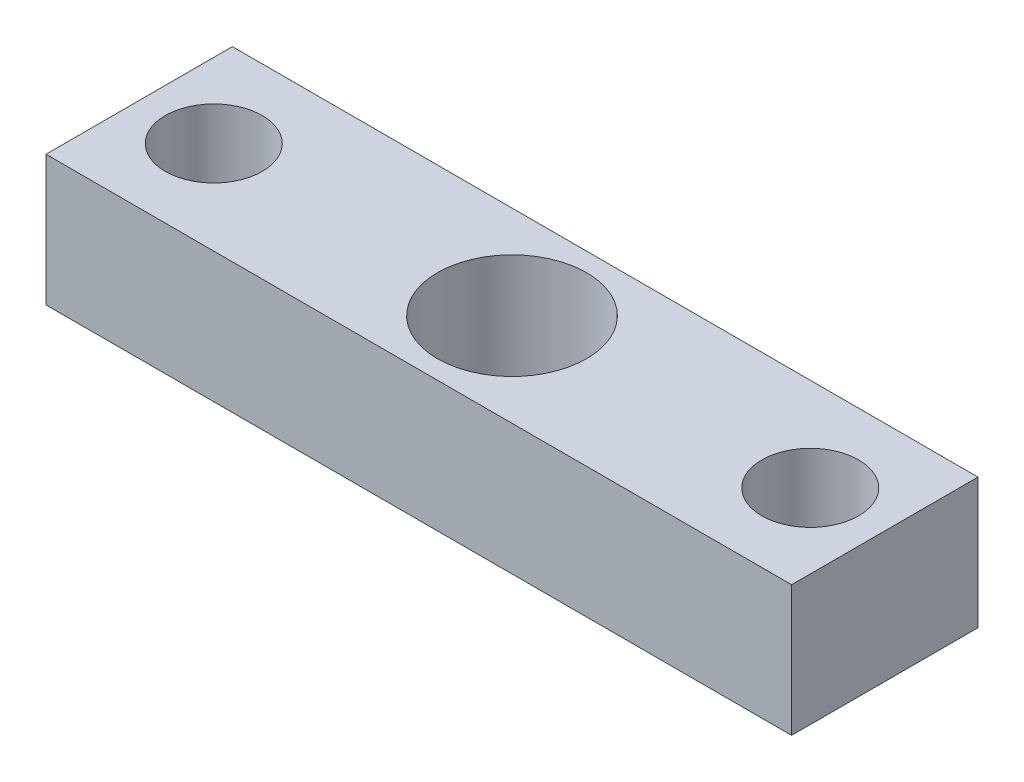
ISO-10303-21;
HEADER;
FILE_DESCRIPTION(('STEP AP214'),'2;1');
FILE_NAME('part.step','',(''),(''),'','','');
FILE_SCHEMA(('AUTOMOTIVE_DESIGN { 1 0 10303 214 1 1 1 1 }'));
ENDSEC;
DATA;
#1=APPLICATION_CONTEXT('core data for automotive mechanical design processes');
#2=APPLICATION_PROTOCOL_DEFINITION('international standard','automotive_design',2000,#1);
#3=PRODUCT_CONTEXT('',#1,'mechanical');
#4=PRODUCT('Part','Part','',(#3));
#5=PRODUCT_RELATED_PRODUCT_CATEGORY('part','',(#4));
#6=PRODUCT_DEFINITION_FORMATION('','',#4);
#7=PRODUCT_DEFINITION_CONTEXT('part definition',#1,'design');
#8=PRODUCT_DEFINITION('design','',#6,#7);
#9=PRODUCT_DEFINITION_SHAPE('','',#8);
#10=(LENGTH_UNIT() NAMED_UNIT(*) SI_UNIT(.MILLI.,.METRE.));
#11=(NAMED_UNIT(*) PLANE_ANGLE_UNIT() SI_UNIT($,.RADIAN.));
#12=(NAMED_UNIT(*) SI_UNIT($,.STERADIAN.) SOLID_ANGLE_UNIT());
#13=UNCERTAINTY_MEASURE_WITH_UNIT(LENGTH_MEASURE(1.E-05),#10,'distance_accuracy_value','');
#14=(GEOMETRIC_REPRESENTATION_CONTEXT(3) GLOBAL_UNCERTAINTY_ASSIGNED_CONTEXT((#13)) GLOBAL_UNIT_ASSIGNED_CONTEXT((#10,
#11,#12)) REPRESENTATION_CONTEXT('',''));
#15=CARTESIAN_POINT('',(0.,0.,0.));
#16=DIRECTION('',(0.,0.,1.));
#17=DIRECTION('',(1.,0.,0.));
#18=AXIS2_PLACEMENT_3D('',#15,#16,#17);
#19=CARTESIAN_POINT('',(0.,7.,0.));
#20=DIRECTION('',(0.,1.,0.));
#21=DIRECTION('',(0.,0.,1.));
#22=AXIS2_PLACEMENT_3D('',#19,#20,#21);
#23=PLANE('',#22);
#24=CARTESIAN_POINT('',(16.,7.,0.));
#25=DIRECTION('',(0.,1.,0.));
#26=DIRECTION('',(0.,0.,1.));
#27=AXIS2_PLACEMENT_3D('',#24,#25,#26);
#28=CIRCLE('',#27,2.6);
#29=CARTESIAN_POINT('',(16.,7.,2.6));
#30=VERTEX_POINT('',#29);
#31=EDGE_CURVE('E118',#30,#30,#28,.T.);
#32=ORIENTED_EDGE('',*,*,#31,.F.);
#33=EDGE_LOOP('',(#32));
#34=FACE_BOUND('',#33,.T.);
#35=DIRECTION('',(0.,0.,1.));
#36=VECTOR('',#35,1.);
#37=CARTESIAN_POINT('',(-20.,7.,5.));
#38=LINE('',#37,#36);
#39=CARTESIAN_POINT('',(-20.,7.,-5.));
#40=VERTEX_POINT('',#39);
#41=CARTESIAN_POINT('',(-20.,7.,5.));
#42=VERTEX_POINT('',#41);
#43=EDGE_CURVE('E88',#40,#42,#38,.T.);
#44=ORIENTED_EDGE('',*,*,#43,.T.);
#45=DIRECTION('',(1.,0.,0.));
#46=VECTOR('',#45,1.);
#47=CARTESIAN_POINT('',(20.,7.,5.));
#48=LINE('',#47,#46);
#49=CARTESIAN_POINT('',(20.,7.,5.));
#50=VERTEX_POINT('',#49);
#51=EDGE_CURVE('E83',#42,#50,#48,.T.);
#52=ORIENTED_EDGE('',*,*,#51,.T.);
#53=DIRECTION('',(0.,0.,-1.));
#54=VECTOR('',#53,1.);
#55=CARTESIAN_POINT('',(20.,7.,5.));
#56=LINE('',#55,#54);
#57=CARTESIAN_POINT('',(20.,7.,-5.00000000000001));
#58=VERTEX_POINT('',#57);
#59=EDGE_CURVE('E86',#50,#58,#56,.T.);
#60=ORIENTED_EDGE('',*,*,#59,.T.);
#61=DIRECTION('',(-1.,0.,0.));
#62=VECTOR('',#61,1.);
#63=CARTESIAN_POINT('',(20.,7.,-5.00000000000001));
#64=LINE('',#63,#62);
#65=EDGE_CURVE('E53',#58,#40,#64,.T.);
#66=ORIENTED_EDGE('',*,*,#65,.T.);
#67=EDGE_LOOP('',(#44,#52,#60,#66));
#68=FACE_BOUND('',#67,.T.);
#69=CARTESIAN_POINT('',(-16.,7.,0.));
#70=DIRECTION('',(0.,1.,0.));
#71=DIRECTION('',(0.,0.,1.));
#72=AXIS2_PLACEMENT_3D('',#69,#70,#71);
#73=CIRCLE('',#72,2.6);
#74=CARTESIAN_POINT('',(-16.,7.,2.6));
#75=VERTEX_POINT('',#74);
#76=EDGE_CURVE('E103',#75,#75,#73,.T.);
#77=ORIENTED_EDGE('',*,*,#76,.F.);
#78=EDGE_LOOP('',(#77));
#79=FACE_BOUND('',#78,.T.);
#80=CARTESIAN_POINT('',(0.,7.,0.));
#81=DIRECTION('',(0.,1.,0.));
#82=DIRECTION('',(0.,0.,1.));
#83=AXIS2_PLACEMENT_3D('',#80,#81,#82);
#84=CIRCLE('',#83,4.);
#85=CARTESIAN_POINT('',(0.,7.,4.));
#86=VERTEX_POINT('',#85);
#87=EDGE_CURVE('E124',#86,#86,#84,.T.);
#88=ORIENTED_EDGE('',*,*,#87,.F.);
#89=EDGE_LOOP('',(#88));
#90=FACE_BOUND('',#89,.T.);
#91=ADVANCED_FACE('F36',(#34,#68,#79,#90),#23,.T.);
#92=CARTESIAN_POINT('',(0.,0.,0.));
#93=DIRECTION('',(0.,1.,0.));
#94=DIRECTION('',(0.,0.,1.));
#95=AXIS2_PLACEMENT_3D('',#92,#93,#94);
#96=PLANE('',#95);
#97=DIRECTION('',(0.,0.,1.));
#98=VECTOR('',#97,1.);
#99=CARTESIAN_POINT('',(-20.,0.,5.));
#100=LINE('',#99,#98);
#101=CARTESIAN_POINT('',(-20.,0.,-5.));
#102=VERTEX_POINT('',#101);
#103=CARTESIAN_POINT('',(-20.,0.,5.));
#104=VERTEX_POINT('',#103);
#105=EDGE_CURVE('E100',#102,#104,#100,.T.);
#106=ORIENTED_EDGE('',*,*,#105,.F.);
#107=DIRECTION('',(-1.,0.,0.));
#108=VECTOR('',#107,1.);
#109=CARTESIAN_POINT('',(20.,0.,-5.00000000000001));
#110=LINE('',#109,#108);
#111=CARTESIAN_POINT('',(20.,0.,-5.00000000000001));
#112=VERTEX_POINT('',#111);
#113=EDGE_CURVE('E76',#112,#102,#110,.T.);
#114=ORIENTED_EDGE('',*,*,#113,.F.);
#115=DIRECTION('',(0.,0.,-1.));
#116=VECTOR('',#115,1.);
#117=CARTESIAN_POINT('',(20.,0.,5.));
#118=LINE('',#117,#116);
#119=CARTESIAN_POINT('',(20.,0.,5.));
#120=VERTEX_POINT('',#119);
#121=EDGE_CURVE('E70',#120,#112,#118,.T.);
#122=ORIENTED_EDGE('',*,*,#121,.F.);
#123=DIRECTION('',(1.,0.,0.));
#124=VECTOR('',#123,1.);
#125=CARTESIAN_POINT('',(20.,0.,5.));
#126=LINE('',#125,#124);
#127=EDGE_CURVE('E92',#104,#120,#126,.T.);
#128=ORIENTED_EDGE('',*,*,#127,.F.);
#129=EDGE_LOOP('',(#106,#114,#122,#128));
#130=FACE_BOUND('',#129,.T.);
#131=CARTESIAN_POINT('',(-16.,0.,0.));
#132=DIRECTION('',(0.,1.,0.));
#133=DIRECTION('',(0.,0.,1.));
#134=AXIS2_PLACEMENT_3D('',#131,#132,#133);
#135=CIRCLE('',#134,2.6);
#136=CARTESIAN_POINT('',(-16.,0.,2.6));
#137=VERTEX_POINT('',#136);
#138=EDGE_CURVE('E115',#137,#137,#135,.T.);
#139=ORIENTED_EDGE('',*,*,#138,.T.);
#140=EDGE_LOOP('',(#139));
#141=FACE_BOUND('',#140,.T.);
#142=CARTESIAN_POINT('',(16.,0.,0.));
#143=DIRECTION('',(0.,1.,0.));
#144=DIRECTION('',(0.,0.,1.));
#145=AXIS2_PLACEMENT_3D('',#142,#143,#144);
#146=CIRCLE('',#145,2.6);
#147=CARTESIAN_POINT('',(16.,0.,2.6));
#148=VERTEX_POINT('',#147);
#149=EDGE_CURVE('E121',#148,#148,#146,.T.);
#150=ORIENTED_EDGE('',*,*,#149,.T.);
#151=EDGE_LOOP('',(#150));
#152=FACE_BOUND('',#151,.T.);
#153=CARTESIAN_POINT('',(0.,0.,0.));
#154=DIRECTION('',(0.,1.,0.));
#155=DIRECTION('',(0.,0.,1.));
#156=AXIS2_PLACEMENT_3D('',#153,#154,#155);
#157=CIRCLE('',#156,4.);
#158=CARTESIAN_POINT('',(0.,0.,4.));
#159=VERTEX_POINT('',#158);
#160=EDGE_CURVE('E127',#159,#159,#157,.T.);
#161=ORIENTED_EDGE('',*,*,#160,.T.);
#162=EDGE_LOOP('',(#161));
#163=FACE_BOUND('',#162,.T.);
#164=ADVANCED_FACE('F111',(#130,#141,#152,#163),#96,.F.);
#165=CARTESIAN_POINT('',(-20.,7.,5.));
#166=DIRECTION('',(1.,0.,0.));
#167=DIRECTION('',(0.,0.,-1.));
#168=AXIS2_PLACEMENT_3D('',#165,#166,#167);
#169=PLANE('',#168);
#170=ORIENTED_EDGE('',*,*,#105,.T.);
#171=DIRECTION('',(0.,-1.,0.));
#172=VECTOR('',#171,1.);
#173=CARTESIAN_POINT('',(-20.,7.,5.));
#174=LINE('',#173,#172);
#175=EDGE_CURVE('E11',#42,#104,#174,.T.);
#176=ORIENTED_EDGE('',*,*,#175,.F.);
#177=ORIENTED_EDGE('',*,*,#43,.F.);
#178=DIRECTION('',(0.,-1.,0.));
#179=VECTOR('',#178,1.);
#180=CARTESIAN_POINT('',(-20.,7.,-5.));
#181=LINE('',#180,#179);
#182=EDGE_CURVE('E96',#40,#102,#181,.T.);
#183=ORIENTED_EDGE('',*,*,#182,.T.);
#184=EDGE_LOOP('',(#170,#176,#177,#183));
#185=FACE_BOUND('',#184,.T.);
#186=ADVANCED_FACE('F38',(#185),#169,.F.);
#187=CARTESIAN_POINT('',(20.,7.,5.));
#188=DIRECTION('',(0.,0.,-1.));
#189=DIRECTION('',(-1.,0.,0.));
#190=AXIS2_PLACEMENT_3D('',#187,#188,#189);
#191=PLANE('',#190);
#192=ORIENTED_EDGE('',*,*,#127,.T.);
#193=DIRECTION('',(0.,-1.,0.));
#194=VECTOR('',#193,1.);
#195=CARTESIAN_POINT('',(20.,7.,5.));
#196=LINE('',#195,#194);
#197=EDGE_CURVE('E45',#50,#120,#196,.T.);
#198=ORIENTED_EDGE('',*,*,#197,.F.);
#199=ORIENTED_EDGE('',*,*,#51,.F.);
#200=ORIENTED_EDGE('',*,*,#175,.T.);
#201=EDGE_LOOP('',(#192,#198,#199,#200));
#202=FACE_BOUND('',#201,.T.);
#203=ADVANCED_FACE('F91',(#202),#191,.F.);
#204=CARTESIAN_POINT('',(20.,7.,5.));
#205=DIRECTION('',(-1.,0.,0.));
#206=DIRECTION('',(0.,0.,1.));
#207=AXIS2_PLACEMENT_3D('',#204,#205,#206);
#208=PLANE('',#207);
#209=ORIENTED_EDGE('',*,*,#121,.T.);
#210=DIRECTION('',(0.,-1.,0.));
#211=VECTOR('',#210,1.);
#212=CARTESIAN_POINT('',(20.,7.,-5.00000000000001));
#213=LINE('',#212,#211);
#214=EDGE_CURVE('E93',#58,#112,#213,.T.);
#215=ORIENTED_EDGE('',*,*,#214,.F.);
#216=ORIENTED_EDGE('',*,*,#59,.F.);
#217=ORIENTED_EDGE('',*,*,#197,.T.);
#218=EDGE_LOOP('',(#209,#215,#216,#217));
#219=FACE_BOUND('',#218,.T.);
#220=ADVANCED_FACE('F94',(#219),#208,.F.);
#221=CARTESIAN_POINT('',(20.,7.,-5.00000000000001));
#222=DIRECTION('',(0.,0.,1.));
#223=DIRECTION('',(1.,0.,0.));
#224=AXIS2_PLACEMENT_3D('',#221,#222,#223);
#225=PLANE('',#224);
#226=ORIENTED_EDGE('',*,*,#113,.T.);
#227=ORIENTED_EDGE('',*,*,#182,.F.);
#228=ORIENTED_EDGE('',*,*,#65,.F.);
#229=ORIENTED_EDGE('',*,*,#214,.T.);
#230=EDGE_LOOP('',(#226,#227,#228,#229));
#231=FACE_BOUND('',#230,.T.);
#232=ADVANCED_FACE('F108',(#231),#225,.F.);
#233=CARTESIAN_POINT('',(-16.,7.,0.));
#234=DIRECTION('',(0.,-1.,0.));
#235=DIRECTION('',(0.,0.,-1.));
#236=AXIS2_PLACEMENT_3D('',#233,#234,#235);
#237=CYLINDRICAL_SURFACE('',#236,2.6);
#238=ORIENTED_EDGE('',*,*,#76,.T.);
#239=EDGE_LOOP('',(#238));
#240=FACE_BOUND('',#239,.T.);
#241=ORIENTED_EDGE('',*,*,#138,.F.);
#242=EDGE_LOOP('',(#241));
#243=FACE_BOUND('',#242,.T.);
#244=ADVANCED_FACE('F145',(#240,#243),#237,.F.);
#245=CARTESIAN_POINT('',(16.,7.,0.));
#246=DIRECTION('',(0.,-1.,0.));
#247=DIRECTION('',(0.,0.,-1.));
#248=AXIS2_PLACEMENT_3D('',#245,#246,#247);
#249=CYLINDRICAL_SURFACE('',#248,2.6);
#250=ORIENTED_EDGE('',*,*,#31,.T.);
#251=EDGE_LOOP('',(#250));
#252=FACE_BOUND('',#251,.T.);
#253=ORIENTED_EDGE('',*,*,#149,.F.);
#254=EDGE_LOOP('',(#253));
#255=FACE_BOUND('',#254,.T.);
#256=ADVANCED_FACE('F191',(#252,#255),#249,.F.);
#257=CARTESIAN_POINT('',(0.,7.,0.));
#258=DIRECTION('',(0.,-1.,0.));
#259=DIRECTION('',(0.,0.,-1.));
#260=AXIS2_PLACEMENT_3D('',#257,#258,#259);
#261=CYLINDRICAL_SURFACE('',#260,4.);
#262=ORIENTED_EDGE('',*,*,#87,.T.);
#263=EDGE_LOOP('',(#262));
#264=FACE_BOUND('',#263,.T.);
#265=ORIENTED_EDGE('',*,*,#160,.F.);
#266=EDGE_LOOP('',(#265));
#267=FACE_BOUND('',#266,.T.);
#268=ADVANCED_FACE('F133',(#264,#267),#261,.F.);
#269=CLOSED_SHELL('',(#91,#164,#186,#203,#220,#232,#244,#256,#268));
#270=MANIFOLD_SOLID_BREP('B2',#269);
#271=ADVANCED_BREP_SHAPE_REPRESENTATION('',(#18,#270),#14);
#272=SHAPE_DEFINITION_REPRESENTATION(#9,#271);
ENDSEC;
END-ISO-10303-21;
